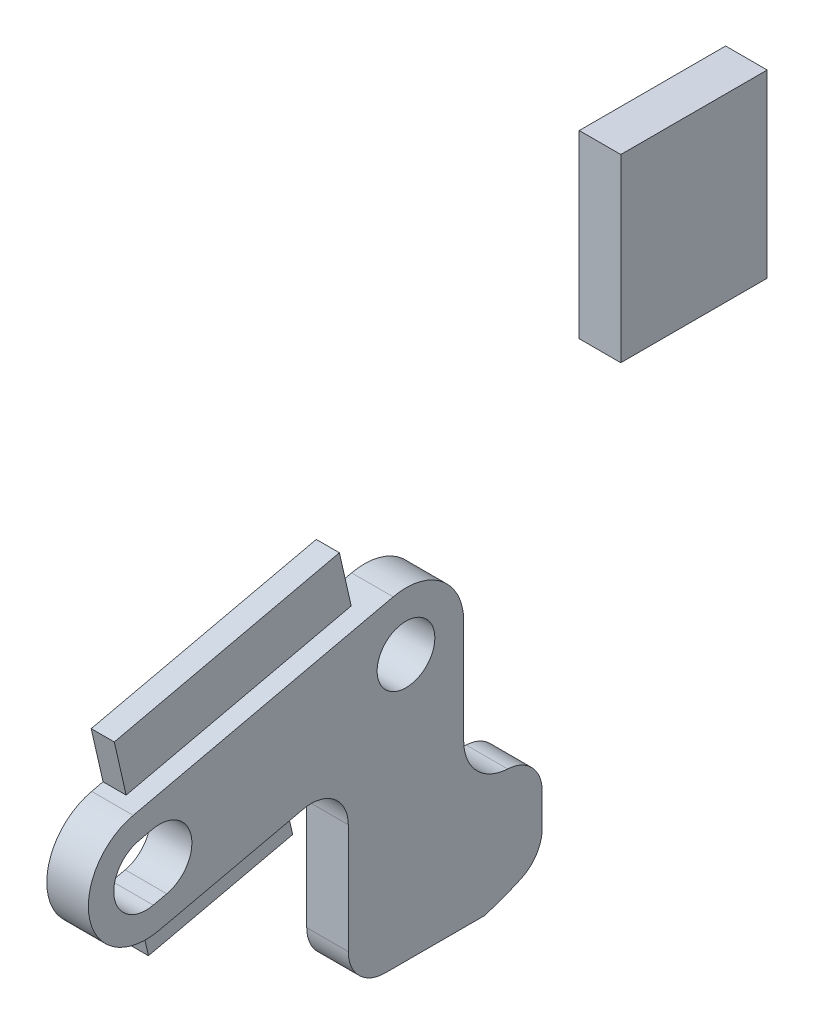
ISO-10303-21;
HEADER;
FILE_DESCRIPTION(('STEP AP214'),'2;1');
FILE_NAME('part.step','',(''),(''),'','','');
FILE_SCHEMA(('AUTOMOTIVE_DESIGN { 1 0 10303 214 1 1 1 1 }'));
ENDSEC;
DATA;
#1=APPLICATION_CONTEXT('core data for automotive mechanical design processes');
#2=APPLICATION_PROTOCOL_DEFINITION('international standard','automotive_design',2000,#1);
#3=PRODUCT_CONTEXT('',#1,'mechanical');
#4=PRODUCT('Part','Part','',(#3));
#5=PRODUCT_RELATED_PRODUCT_CATEGORY('part','',(#4));
#6=PRODUCT_DEFINITION_FORMATION('','',#4);
#7=PRODUCT_DEFINITION_CONTEXT('part definition',#1,'design');
#8=PRODUCT_DEFINITION('design','',#6,#7);
#9=PRODUCT_DEFINITION_SHAPE('','',#8);
#10=(LENGTH_UNIT() NAMED_UNIT(*) SI_UNIT(.MILLI.,.METRE.));
#11=(NAMED_UNIT(*) PLANE_ANGLE_UNIT() SI_UNIT($,.RADIAN.));
#12=(NAMED_UNIT(*) SI_UNIT($,.STERADIAN.) SOLID_ANGLE_UNIT());
#13=UNCERTAINTY_MEASURE_WITH_UNIT(LENGTH_MEASURE(1.E-05),#10,'distance_accuracy_value','');
#14=(GEOMETRIC_REPRESENTATION_CONTEXT(3) GLOBAL_UNCERTAINTY_ASSIGNED_CONTEXT((#13)) GLOBAL_UNIT_ASSIGNED_CONTEXT((#10,
#11,#12)) REPRESENTATION_CONTEXT('',''));
#15=CARTESIAN_POINT('',(0.,0.,0.));
#16=DIRECTION('',(0.,0.,1.));
#17=DIRECTION('',(1.,0.,0.));
#18=AXIS2_PLACEMENT_3D('',#15,#16,#17);
#19=CARTESIAN_POINT('',(-12.7783936670699,45.2138103486577,-7.49877949980136));
#20=DIRECTION('',(0.,0.,1.));
#21=DIRECTION('',(1.,0.,0.));
#22=AXIS2_PLACEMENT_3D('',#19,#20,#21);
#23=PLANE('',#22);
#24=DIRECTION('',(0.,1.,0.));
#25=VECTOR('',#24,1.);
#26=CARTESIAN_POINT('',(0.,45.2138103486577,-7.49877949980136));
#27=LINE('',#26,#25);
#28=CARTESIAN_POINT('',(0.,35.2927508898382,-7.49877949980136));
#29=VERTEX_POINT('',#28);
#30=CARTESIAN_POINT('',(0.,45.2138103486577,-7.49877949980136));
#31=VERTEX_POINT('',#30);
#32=EDGE_CURVE('E61',#29,#31,#27,.T.);
#33=ORIENTED_EDGE('',*,*,#32,.F.);
#34=DIRECTION('',(1.,0.,0.));
#35=VECTOR('',#34,1.);
#36=CARTESIAN_POINT('',(-12.7783936670699,35.2927508898382,-7.49877949980136));
#37=LINE('',#36,#35);
#38=CARTESIAN_POINT('',(2.286,35.2927508898382,-7.49877949980136));
#39=VERTEX_POINT('',#38);
#40=EDGE_CURVE('E89',#29,#39,#37,.T.);
#41=ORIENTED_EDGE('',*,*,#40,.T.);
#42=DIRECTION('',(0.,-1.,0.));
#43=VECTOR('',#42,1.);
#44=CARTESIAN_POINT('',(2.286,45.2138103486577,-7.49877949980136));
#45=LINE('',#44,#43);
#46=CARTESIAN_POINT('',(2.286,45.2138103486577,-7.49877949980136));
#47=VERTEX_POINT('',#46);
#48=EDGE_CURVE('E93',#47,#39,#45,.T.);
#49=ORIENTED_EDGE('',*,*,#48,.F.);
#50=DIRECTION('',(1.,0.,0.));
#51=VECTOR('',#50,1.);
#52=CARTESIAN_POINT('',(-12.7783936670699,45.2138103486577,-7.49877949980136));
#53=LINE('',#52,#51);
#54=EDGE_CURVE('E116',#31,#47,#53,.T.);
#55=ORIENTED_EDGE('',*,*,#54,.F.);
#56=EDGE_LOOP('',(#33,#41,#49,#55));
#57=FACE_BOUND('',#56,.T.);
#58=ADVANCED_FACE('F53',(#57),#23,.T.);
#59=CARTESIAN_POINT('',(-12.7783936670699,45.2138103486577,-7.49877949980136));
#60=DIRECTION('',(0.,1.,0.));
#61=DIRECTION('',(0.,0.,1.));
#62=AXIS2_PLACEMENT_3D('',#59,#60,#61);
#63=PLANE('',#62);
#64=DIRECTION('',(0.,0.,-1.));
#65=VECTOR('',#64,1.);
#66=CARTESIAN_POINT('',(0.,45.2138103486577,-7.49877949980136));
#67=LINE('',#66,#65);
#68=CARTESIAN_POINT('',(0.,45.2138103486577,-15.5523454134313));
#69=VERTEX_POINT('',#68);
#70=EDGE_CURVE('E67',#31,#69,#67,.T.);
#71=ORIENTED_EDGE('',*,*,#70,.F.);
#72=ORIENTED_EDGE('',*,*,#54,.T.);
#73=DIRECTION('',(0.,0.,1.));
#74=VECTOR('',#73,1.);
#75=CARTESIAN_POINT('',(2.286,45.2138103486577,-7.49877949980136));
#76=LINE('',#75,#74);
#77=CARTESIAN_POINT('',(2.286,45.2138103486577,-15.5523454134313));
#78=VERTEX_POINT('',#77);
#79=EDGE_CURVE('E98',#78,#47,#76,.T.);
#80=ORIENTED_EDGE('',*,*,#79,.F.);
#81=DIRECTION('',(1.,0.,0.));
#82=VECTOR('',#81,1.);
#83=CARTESIAN_POINT('',(-12.7783936670699,45.2138103486577,-15.5523454134313));
#84=LINE('',#83,#82);
#85=EDGE_CURVE('E119',#69,#78,#84,.T.);
#86=ORIENTED_EDGE('',*,*,#85,.F.);
#87=EDGE_LOOP('',(#71,#72,#80,#86));
#88=FACE_BOUND('',#87,.T.);
#89=ADVANCED_FACE('F125',(#88),#63,.T.);
#90=CARTESIAN_POINT('',(-12.7783936670699,45.2138103486577,-15.5523454134313));
#91=DIRECTION('',(0.,0.,-1.));
#92=DIRECTION('',(-1.,0.,0.));
#93=AXIS2_PLACEMENT_3D('',#90,#91,#92);
#94=PLANE('',#93);
#95=DIRECTION('',(0.,-1.,0.));
#96=VECTOR('',#95,1.);
#97=CARTESIAN_POINT('',(0.,45.2138103486577,-15.5523454134313));
#98=LINE('',#97,#96);
#99=CARTESIAN_POINT('',(0.,35.2927508898382,-15.5523454134313));
#100=VERTEX_POINT('',#99);
#101=EDGE_CURVE('E118',#69,#100,#98,.T.);
#102=ORIENTED_EDGE('',*,*,#101,.F.);
#103=ORIENTED_EDGE('',*,*,#85,.T.);
#104=DIRECTION('',(0.,1.,0.));
#105=VECTOR('',#104,1.);
#106=CARTESIAN_POINT('',(2.286,45.2138103486577,-15.5523454134313));
#107=LINE('',#106,#105);
#108=CARTESIAN_POINT('',(2.286,35.2927508898382,-15.5523454134313));
#109=VERTEX_POINT('',#108);
#110=EDGE_CURVE('E106',#109,#78,#107,.T.);
#111=ORIENTED_EDGE('',*,*,#110,.F.);
#112=DIRECTION('',(1.,0.,0.));
#113=VECTOR('',#112,1.);
#114=CARTESIAN_POINT('',(-12.7783936670699,35.2927508898382,-15.5523454134313));
#115=LINE('',#114,#113);
#116=EDGE_CURVE('E97',#100,#109,#115,.T.);
#117=ORIENTED_EDGE('',*,*,#116,.F.);
#118=EDGE_LOOP('',(#102,#103,#111,#117));
#119=FACE_BOUND('',#118,.T.);
#120=ADVANCED_FACE('F123',(#119),#94,.T.);
#121=CARTESIAN_POINT('',(-12.7783936670699,35.2927508898382,-7.49877949980136));
#122=DIRECTION('',(0.,-1.,0.));
#123=DIRECTION('',(0.,0.,-1.));
#124=AXIS2_PLACEMENT_3D('',#121,#122,#123);
#125=PLANE('',#124);
#126=DIRECTION('',(0.,0.,1.));
#127=VECTOR('',#126,1.);
#128=CARTESIAN_POINT('',(0.,35.2927508898382,-7.49877949980136));
#129=LINE('',#128,#127);
#130=EDGE_CURVE('E12',#100,#29,#129,.T.);
#131=ORIENTED_EDGE('',*,*,#130,.F.);
#132=ORIENTED_EDGE('',*,*,#116,.T.);
#133=DIRECTION('',(0.,0.,-1.));
#134=VECTOR('',#133,1.);
#135=CARTESIAN_POINT('',(2.286,35.2927508898382,-7.49877949980136));
#136=LINE('',#135,#134);
#137=EDGE_CURVE('E100',#39,#109,#136,.T.);
#138=ORIENTED_EDGE('',*,*,#137,.F.);
#139=ORIENTED_EDGE('',*,*,#40,.F.);
#140=EDGE_LOOP('',(#131,#132,#138,#139));
#141=FACE_BOUND('',#140,.T.);
#142=ADVANCED_FACE('F101',(#141),#125,.T.);
#143=CARTESIAN_POINT('',(2.286,0.,0.));
#144=DIRECTION('',(1.,0.,0.));
#145=DIRECTION('',(0.,0.,-1.));
#146=AXIS2_PLACEMENT_3D('',#143,#144,#145);
#147=PLANE('',#146);
#148=ORIENTED_EDGE('',*,*,#48,.T.);
#149=ORIENTED_EDGE('',*,*,#137,.T.);
#150=ORIENTED_EDGE('',*,*,#110,.T.);
#151=ORIENTED_EDGE('',*,*,#79,.T.);
#152=EDGE_LOOP('',(#148,#149,#150,#151));
#153=FACE_BOUND('',#152,.T.);
#154=ADVANCED_FACE('F108',(#153),#147,.T.);
#155=CARTESIAN_POINT('',(0.,24.0453194559547,18.6173248138089));
#156=DIRECTION('',(1.,0.,0.));
#157=DIRECTION('',(0.,0.,-1.));
#158=AXIS2_PLACEMENT_3D('',#155,#156,#157);
#159=PLANE('',#158);
#160=ORIENTED_EDGE('',*,*,#32,.T.);
#161=ORIENTED_EDGE('',*,*,#70,.T.);
#162=ORIENTED_EDGE('',*,*,#101,.T.);
#163=ORIENTED_EDGE('',*,*,#130,.T.);
#164=EDGE_LOOP('',(#160,#161,#162,#163));
#165=FACE_BOUND('',#164,.T.);
#166=ADVANCED_FACE('F127',(#165),#159,.F.);
#167=CLOSED_SHELL('',(#58,#89,#120,#142,#154,#166));
#168=MANIFOLD_SOLID_BREP('B2',#167);
#169=CARTESIAN_POINT('',(2.286,23.3247743636414,7.493));
#170=DIRECTION('',(0.,0.974987740626705,0.222258645788262));
#171=DIRECTION('',(0.,-0.222258645788262,0.974987740626705));
#172=AXIS2_PLACEMENT_3D('',#169,#170,#171);
#173=PLANE('',#172);
#174=DIRECTION('',(0.,0.222258645788262,-0.974987740626705));
#175=VECTOR('',#174,1.);
#176=CARTESIAN_POINT('',(1.27,22.7586050453254,9.97662956824175));
#177=LINE('',#176,#175);
#178=CARTESIAN_POINT('',(1.27,20.9497333794648,17.9116536134312));
#179=VERTEX_POINT('',#178);
#180=CARTESIAN_POINT('',(1.27,22.7586050453254,9.97662956824175));
#181=VERTEX_POINT('',#180);
#182=EDGE_CURVE('E357',#179,#181,#177,.T.);
#183=ORIENTED_EDGE('',*,*,#182,.T.);
#184=DIRECTION('',(-1.,0.,0.));
#185=VECTOR('',#184,1.);
#186=CARTESIAN_POINT('',(2.286,22.7586050453254,9.97662956824175));
#187=LINE('',#186,#185);
#188=CARTESIAN_POINT('',(2.286,22.7586050453254,9.97662956824175));
#189=VERTEX_POINT('',#188);
#190=EDGE_CURVE('E572',#181,#189,#187,.F.);
#191=ORIENTED_EDGE('',*,*,#190,.T.);
#192=DIRECTION('',(0.,0.222258645788262,-0.974987740626706));
#193=VECTOR('',#192,1.);
#194=CARTESIAN_POINT('',(2.286,23.3247743636414,7.493));
#195=LINE('',#194,#193);
#196=CARTESIAN_POINT('',(2.286,20.9497333794648,17.9116536134312));
#197=VERTEX_POINT('',#196);
#198=EDGE_CURVE('E517',#197,#189,#195,.T.);
#199=ORIENTED_EDGE('',*,*,#198,.F.);
#200=DIRECTION('',(-1.,0.,0.));
#201=VECTOR('',#200,1.);
#202=CARTESIAN_POINT('',(2.286,20.9497333794648,17.9116536134312));
#203=LINE('',#202,#201);
#204=EDGE_CURVE('E506',#197,#179,#203,.T.);
#205=ORIENTED_EDGE('',*,*,#204,.T.);
#206=EDGE_LOOP('',(#183,#191,#199,#205));
#207=FACE_BOUND('',#206,.T.);
#208=ADVANCED_FACE('F178',(#207),#173,.F.);
#209=CARTESIAN_POINT('',(2.286,24.0453194559547,18.6173248138089));
#210=DIRECTION('',(1.,0.,0.));
#211=DIRECTION('',(0.,0.,-1.));
#212=AXIS2_PLACEMENT_3D('',#209,#210,#211);
#213=PLANE('',#212);
#214=DIRECTION('',(0.,1.,0.));
#215=VECTOR('',#214,1.);
#216=CARTESIAN_POINT('',(2.286,15.875,-3.175));
#217=LINE('',#216,#215);
#218=CARTESIAN_POINT('',(2.286,15.2692893877702,-3.175));
#219=VERTEX_POINT('',#218);
#220=CARTESIAN_POINT('',(2.286,17.0554310017379,-3.175));
#221=VERTEX_POINT('',#220);
#222=EDGE_CURVE('E550',#219,#221,#217,.T.);
#223=ORIENTED_EDGE('',*,*,#222,.T.);
#224=CARTESIAN_POINT('',(2.286,17.0554310017379,-1.175));
#225=DIRECTION('',(1.,0.,0.));
#226=DIRECTION('',(0.,0.,-1.));
#227=AXIS2_PLACEMENT_3D('',#224,#225,#226);
#228=CIRCLE('',#227,2.);
#229=CARTESIAN_POINT('',(2.286,19.0530384899591,-1.27279735682819));
#230=VERTEX_POINT('',#229);
#231=EDGE_CURVE('E51',#221,#230,#228,.T.);
#232=ORIENTED_EDGE('',*,*,#231,.T.);
#233=CARTESIAN_POINT('',(2.286,21.59,-1.397));
#234=DIRECTION('',(1.,0.,0.));
#235=DIRECTION('',(0.,0.,-1.));
#236=AXIS2_PLACEMENT_3D('',#233,#234,#235);
#237=CIRCLE('',#236,2.54);
#238=CARTESIAN_POINT('',(2.286,21.59,1.143));
#239=VERTEX_POINT('',#238);
#240=EDGE_CURVE('E581',#230,#239,#237,.F.);
#241=ORIENTED_EDGE('',*,*,#240,.T.);
#242=DIRECTION('',(0.,1.,0.));
#243=VECTOR('',#242,1.);
#244=CARTESIAN_POINT('',(2.286,27.305,1.143));
#245=LINE('',#244,#243);
#246=CARTESIAN_POINT('',(2.286,27.305,1.143));
#247=VERTEX_POINT('',#246);
#248=EDGE_CURVE('E552',#239,#247,#245,.T.);
#249=ORIENTED_EDGE('',*,*,#248,.T.);
#250=CARTESIAN_POINT('',(2.286,27.305,4.318));
#251=DIRECTION('',(1.,0.,0.));
#252=DIRECTION('',(0.,0.,-1.));
#253=AXIS2_PLACEMENT_3D('',#250,#251,#252);
#254=CIRCLE('',#253,3.175);
#255=CARTESIAN_POINT('',(2.286,30.4005860764898,5.0236712003777));
#256=VERTEX_POINT('',#255);
#257=EDGE_CURVE('E446',#247,#256,#254,.T.);
#258=ORIENTED_EDGE('',*,*,#257,.T.);
#259=DIRECTION('',(0.,-0.222258645788251,0.974987740626708));
#260=VECTOR('',#259,1.);
#261=CARTESIAN_POINT('',(2.286,27.1409055324445,19.3229960141867));
#262=LINE('',#261,#260);
#263=CARTESIAN_POINT('',(2.286,27.1409055324445,19.3229960141867));
#264=VERTEX_POINT('',#263);
#265=EDGE_CURVE('E440',#256,#264,#262,.T.);
#266=ORIENTED_EDGE('',*,*,#265,.T.);
#267=CARTESIAN_POINT('',(2.286,24.0453194559547,18.6173248138089));
#268=DIRECTION('',(1.,0.,0.));
#269=DIRECTION('',(0.,0.,-1.));
#270=AXIS2_PLACEMENT_3D('',#267,#268,#269);
#271=CIRCLE('',#270,3.17500000000008);
#272=EDGE_CURVE('E514',#264,#197,#271,.T.);
#273=ORIENTED_EDGE('',*,*,#272,.T.);
#274=ORIENTED_EDGE('',*,*,#198,.T.);
#275=CARTESIAN_POINT('',(2.286,20.777429956372,9.525));
#276=DIRECTION('',(1.,0.,0.));
#277=DIRECTION('',(0.,0.,-1.));
#278=AXIS2_PLACEMENT_3D('',#275,#276,#277);
#279=CIRCLE('',#278,2.032);
#280=CARTESIAN_POINT('',(2.286,20.777429956372,7.493));
#281=VERTEX_POINT('',#280);
#282=EDGE_CURVE('E576',#189,#281,#279,.F.);
#283=ORIENTED_EDGE('',*,*,#282,.T.);
#284=DIRECTION('',(0.,-1.,0.));
#285=VECTOR('',#284,1.);
#286=CARTESIAN_POINT('',(2.286,12.7,7.493));
#287=LINE('',#286,#285);
#288=CARTESIAN_POINT('',(2.286,14.732,7.493));
#289=VERTEX_POINT('',#288);
#290=EDGE_CURVE('E544',#281,#289,#287,.T.);
#291=ORIENTED_EDGE('',*,*,#290,.T.);
#292=CARTESIAN_POINT('',(2.286,14.732,5.461));
#293=DIRECTION('',(1.,0.,0.));
#294=DIRECTION('',(0.,0.,-1.));
#295=AXIS2_PLACEMENT_3D('',#292,#293,#294);
#296=CIRCLE('',#295,2.032);
#297=CARTESIAN_POINT('',(2.286,12.7,5.461));
#298=VERTEX_POINT('',#297);
#299=EDGE_CURVE('E570',#289,#298,#296,.T.);
#300=ORIENTED_EDGE('',*,*,#299,.T.);
#301=DIRECTION('',(0.,0.,-1.));
#302=VECTOR('',#301,1.);
#303=CARTESIAN_POINT('',(2.286,12.7,-3.175));
#304=LINE('',#303,#302);
#305=CARTESIAN_POINT('',(2.286,12.7,0.));
#306=VERTEX_POINT('',#305);
#307=EDGE_CURVE('E547',#298,#306,#304,.T.);
#308=ORIENTED_EDGE('',*,*,#307,.T.);
#309=CARTESIAN_POINT('',(2.286,27.305,4.318));
#310=DIRECTION('',(-1.,0.,0.));
#311=DIRECTION('',(0.,0.,-1.));
#312=AXIS2_PLACEMENT_3D('',#309,#310,#311);
#313=CIRCLE('',#312,15.229942514665);
#314=CARTESIAN_POINT('',(2.286,13.4498240954776,-2.00538909563079));
#315=VERTEX_POINT('',#314);
#316=EDGE_CURVE('E407',#315,#306,#313,.T.);
#317=ORIENTED_EDGE('',*,*,#316,.F.);
#318=CARTESIAN_POINT('',(2.286,15.2692893877702,-1.175));
#319=DIRECTION('',(1.,0.,0.));
#320=DIRECTION('',(0.,0.,-1.));
#321=AXIS2_PLACEMENT_3D('',#318,#319,#320);
#322=CIRCLE('',#321,2.);
#323=EDGE_CURVE('E586',#315,#219,#322,.T.);
#324=ORIENTED_EDGE('',*,*,#323,.T.);
#325=EDGE_LOOP('',(#223,#232,#241,#249,#258,#266,#273,#274,#283,#291,#300,#308,#317,#324));
#326=FACE_BOUND('',#325,.T.);
#327=CARTESIAN_POINT('',(2.286,27.305,4.318));
#328=DIRECTION('',(1.,0.,0.));
#329=DIRECTION('',(0.,0.,-1.));
#330=AXIS2_PLACEMENT_3D('',#327,#328,#329);
#331=CIRCLE('',#330,1.5875);
#332=CARTESIAN_POINT('',(2.286,27.305,2.7305));
#333=VERTEX_POINT('',#332);
#334=EDGE_CURVE('E528',#333,#333,#331,.T.);
#335=ORIENTED_EDGE('',*,*,#334,.F.);
#336=EDGE_LOOP('',(#335));
#337=FACE_BOUND('',#336,.T.);
#338=DIRECTION('',(0.,0.222258645788256,-0.974987740626707));
#339=VECTOR('',#338,1.);
#340=CARTESIAN_POINT('',(2.286,22.3117912531204,18.2221489415974));
#341=LINE('',#340,#339);
#342=CARTESIAN_POINT('',(2.286,22.3117912531204,18.2221489415974));
#343=VERTEX_POINT('',#342);
#344=CARTESIAN_POINT('',(2.286,22.481152341211,17.4792082832399));
#345=VERTEX_POINT('',#344);
#346=EDGE_CURVE('E425',#343,#345,#341,.T.);
#347=ORIENTED_EDGE('',*,*,#346,.F.);
#348=CARTESIAN_POINT('',(2.286,24.0453194559547,18.6173248138089));
#349=DIRECTION('',(1.,0.,0.));
#350=DIRECTION('',(0.,0.,-1.));
#351=AXIS2_PLACEMENT_3D('',#348,#349,#350);
#352=CIRCLE('',#351,1.778);
#353=CARTESIAN_POINT('',(2.286,25.778847658789,19.0125006860205));
#354=VERTEX_POINT('',#353);
#355=EDGE_CURVE('E421',#354,#343,#352,.T.);
#356=ORIENTED_EDGE('',*,*,#355,.F.);
#357=DIRECTION('',(0.,-0.222258645788258,0.974987740626706));
#358=VECTOR('',#357,1.);
#359=CARTESIAN_POINT('',(2.286,25.778847658789,19.0125006860205));
#360=LINE('',#359,#358);
#361=CARTESIAN_POINT('',(2.286,25.9482087468796,18.2695600276629));
#362=VERTEX_POINT('',#361);
#363=EDGE_CURVE('E913',#362,#354,#360,.T.);
#364=ORIENTED_EDGE('',*,*,#363,.F.);
#365=CARTESIAN_POINT('',(2.286,24.2146805440453,17.8743841554514));
#366=DIRECTION('',(1.,0.,0.));
#367=DIRECTION('',(0.,0.,-1.));
#368=AXIS2_PLACEMENT_3D('',#365,#366,#367);
#369=CIRCLE('',#368,1.77800000000001);
#370=EDGE_CURVE('E928',#345,#362,#369,.T.);
#371=ORIENTED_EDGE('',*,*,#370,.F.);
#372=EDGE_LOOP('',(#347,#356,#364,#371));
#373=FACE_BOUND('',#372,.T.);
#374=ADVANCED_FACE('F554',(#326,#337,#373),#213,.T.);
#375=CARTESIAN_POINT('',(0.,24.0453194559547,18.6173248138089));
#376=DIRECTION('',(1.,0.,0.));
#377=DIRECTION('',(0.,0.,-1.));
#378=AXIS2_PLACEMENT_3D('',#375,#376,#377);
#379=PLANE('',#378);
#380=CARTESIAN_POINT('',(0.,27.305,4.318));
#381=DIRECTION('',(1.,0.,0.));
#382=DIRECTION('',(0.,0.,-1.));
#383=AXIS2_PLACEMENT_3D('',#380,#381,#382);
#384=CIRCLE('',#383,1.5875);
#385=CARTESIAN_POINT('',(0.,27.305,2.7305));
#386=VERTEX_POINT('',#385);
#387=EDGE_CURVE('E532',#386,#386,#384,.T.);
#388=ORIENTED_EDGE('',*,*,#387,.T.);
#389=EDGE_LOOP('',(#388));
#390=FACE_BOUND('',#389,.T.);
#391=CARTESIAN_POINT('',(0.,21.59,-1.397));
#392=DIRECTION('',(1.,0.,0.));
#393=DIRECTION('',(0.,0.,-1.));
#394=AXIS2_PLACEMENT_3D('',#391,#392,#393);
#395=CIRCLE('',#394,2.54);
#396=CARTESIAN_POINT('',(0.,21.59,1.143));
#397=VERTEX_POINT('',#396);
#398=CARTESIAN_POINT('',(0.,19.0530384899591,-1.27279735682819));
#399=VERTEX_POINT('',#398);
#400=EDGE_CURVE('E579',#397,#399,#395,.T.);
#401=ORIENTED_EDGE('',*,*,#400,.T.);
#402=CARTESIAN_POINT('',(0.,17.0554310017379,-1.175));
#403=DIRECTION('',(1.,0.,0.));
#404=DIRECTION('',(0.,0.,-1.));
#405=AXIS2_PLACEMENT_3D('',#402,#403,#404);
#406=CIRCLE('',#405,2.);
#407=CARTESIAN_POINT('',(0.,17.0554310017379,-3.175));
#408=VERTEX_POINT('',#407);
#409=EDGE_CURVE('E595',#399,#408,#406,.F.);
#410=ORIENTED_EDGE('',*,*,#409,.T.);
#411=DIRECTION('',(0.,1.,0.));
#412=VECTOR('',#411,1.);
#413=CARTESIAN_POINT('',(0.,19.05,-3.175));
#414=LINE('',#413,#412);
#415=CARTESIAN_POINT('',(0.,15.2692893877702,-3.175));
#416=VERTEX_POINT('',#415);
#417=EDGE_CURVE('E478',#416,#408,#414,.T.);
#418=ORIENTED_EDGE('',*,*,#417,.F.);
#419=CARTESIAN_POINT('',(0.,15.2692893877702,-1.175));
#420=DIRECTION('',(1.,0.,0.));
#421=DIRECTION('',(0.,0.,-1.));
#422=AXIS2_PLACEMENT_3D('',#419,#420,#421);
#423=CIRCLE('',#422,2.);
#424=CARTESIAN_POINT('',(0.,13.4498240954776,-2.00538909563079));
#425=VERTEX_POINT('',#424);
#426=EDGE_CURVE('E590',#416,#425,#423,.F.);
#427=ORIENTED_EDGE('',*,*,#426,.T.);
#428=CARTESIAN_POINT('',(0.,27.305,4.318));
#429=DIRECTION('',(-1.,0.,0.));
#430=DIRECTION('',(0.,0.,-1.));
#431=AXIS2_PLACEMENT_3D('',#428,#429,#430);
#432=CIRCLE('',#431,15.229942514665);
#433=CARTESIAN_POINT('',(0.,12.7,0.));
#434=VERTEX_POINT('',#433);
#435=EDGE_CURVE('E414',#425,#434,#432,.T.);
#436=ORIENTED_EDGE('',*,*,#435,.T.);
#437=DIRECTION('',(0.,0.,-1.));
#438=VECTOR('',#437,1.);
#439=CARTESIAN_POINT('',(0.,12.7,-3.175));
#440=LINE('',#439,#438);
#441=CARTESIAN_POINT('',(0.,12.7,5.461));
#442=VERTEX_POINT('',#441);
#443=EDGE_CURVE('E474',#442,#434,#440,.T.);
#444=ORIENTED_EDGE('',*,*,#443,.F.);
#445=CARTESIAN_POINT('',(0.,14.732,5.461));
#446=DIRECTION('',(1.,0.,0.));
#447=DIRECTION('',(0.,0.,-1.));
#448=AXIS2_PLACEMENT_3D('',#445,#446,#447);
#449=CIRCLE('',#448,2.032);
#450=CARTESIAN_POINT('',(0.,14.732,7.493));
#451=VERTEX_POINT('',#450);
#452=EDGE_CURVE('E562',#442,#451,#449,.F.);
#453=ORIENTED_EDGE('',*,*,#452,.T.);
#454=DIRECTION('',(0.,-1.,0.));
#455=VECTOR('',#454,1.);
#456=CARTESIAN_POINT('',(0.,12.7,7.493));
#457=LINE('',#456,#455);
#458=CARTESIAN_POINT('',(0.,20.777429956372,7.493));
#459=VERTEX_POINT('',#458);
#460=EDGE_CURVE('E479',#459,#451,#457,.T.);
#461=ORIENTED_EDGE('',*,*,#460,.F.);
#462=CARTESIAN_POINT('',(0.,20.777429956372,9.525));
#463=DIRECTION('',(1.,0.,0.));
#464=DIRECTION('',(0.,0.,-1.));
#465=AXIS2_PLACEMENT_3D('',#462,#463,#464);
#466=CIRCLE('',#465,2.032);
#467=CARTESIAN_POINT('',(0.,22.7586050453254,9.97662956824175));
#468=VERTEX_POINT('',#467);
#469=EDGE_CURVE('E574',#459,#468,#466,.T.);
#470=ORIENTED_EDGE('',*,*,#469,.T.);
#471=DIRECTION('',(0.,-0.974987740626705,-0.222258645788263));
#472=VECTOR('',#471,1.);
#473=CARTESIAN_POINT('',(0.,22.7586050453254,9.97662956824175));
#474=LINE('',#473,#472);
#475=CARTESIAN_POINT('',(0.,20.825502156244,9.53595856039866));
#476=VERTEX_POINT('',#475);
#477=EDGE_CURVE('E380',#468,#476,#474,.T.);
#478=ORIENTED_EDGE('',*,*,#477,.T.);
#479=DIRECTION('',(0.,-0.222258645788262,0.974987740626705));
#480=VECTOR('',#479,1.);
#481=CARTESIAN_POINT('',(0.,20.825502156244,9.53595856039866));
#482=LINE('',#481,#480);
#483=CARTESIAN_POINT('',(0.,19.0166304903833,17.4709826055881));
#484=VERTEX_POINT('',#483);
#485=EDGE_CURVE('E351',#476,#484,#482,.T.);
#486=ORIENTED_EDGE('',*,*,#485,.T.);
#487=DIRECTION('',(0.,0.974987740626705,0.222258645788262));
#488=VECTOR('',#487,1.);
#489=CARTESIAN_POINT('',(0.,20.9497333794648,17.9116536134312));
#490=LINE('',#489,#488);
#491=CARTESIAN_POINT('',(0.,20.9497333794648,17.9116536134312));
#492=VERTEX_POINT('',#491);
#493=EDGE_CURVE('E372',#484,#492,#490,.T.);
#494=ORIENTED_EDGE('',*,*,#493,.T.);
#495=CARTESIAN_POINT('',(0.,24.0453194559547,18.6173248138089));
#496=DIRECTION('',(1.,0.,0.));
#497=DIRECTION('',(0.,0.,-1.));
#498=AXIS2_PLACEMENT_3D('',#495,#496,#497);
#499=CIRCLE('',#498,3.17500000000008);
#500=CARTESIAN_POINT('',(0.,27.1409055324445,19.3229960141867));
#501=VERTEX_POINT('',#500);
#502=EDGE_CURVE('E448',#501,#492,#499,.T.);
#503=ORIENTED_EDGE('',*,*,#502,.F.);
#504=DIRECTION('',(0.,-0.222258645788251,0.974987740626708));
#505=VECTOR('',#504,1.);
#506=CARTESIAN_POINT('',(0.,27.1409055324445,19.3229960141867));
#507=LINE('',#506,#505);
#508=CARTESIAN_POINT('',(0.,27.2834547165691,18.6976718272925));
#509=VERTEX_POINT('',#508);
#510=EDGE_CURVE('E463',#509,#501,#507,.T.);
#511=ORIENTED_EDGE('',*,*,#510,.F.);
#512=DIRECTION('',(0.,0.974987740626708,0.222258645788251));
#513=VECTOR('',#512,1.);
#514=CARTESIAN_POINT('',(0.,27.2834547165691,18.6976718272925));
#515=LINE('',#514,#513);
#516=CARTESIAN_POINT('',(0.,30.1434499845427,19.3496376405366));
#517=VERTEX_POINT('',#516);
#518=EDGE_CURVE('E400',#509,#517,#515,.T.);
#519=ORIENTED_EDGE('',*,*,#518,.T.);
#520=DIRECTION('',(0.,0.222258645788251,-0.974987740626708));
#521=VECTOR('',#520,1.);
#522=CARTESIAN_POINT('',(0.,32.9661347860535,6.96729333457737));
#523=LINE('',#522,#521);
#524=CARTESIAN_POINT('',(0.,32.9661347860535,6.96729333457737));
#525=VERTEX_POINT('',#524);
#526=EDGE_CURVE('E389',#517,#525,#523,.T.);
#527=ORIENTED_EDGE('',*,*,#526,.T.);
#528=DIRECTION('',(0.,-0.974987740626708,-0.222258645788251));
#529=VECTOR('',#528,1.);
#530=CARTESIAN_POINT('',(0.,30.1061395180798,6.31532752133336));
#531=LINE('',#530,#529);
#532=CARTESIAN_POINT('',(0.,30.1061395180798,6.31532752133336));
#533=VERTEX_POINT('',#532);
#534=EDGE_CURVE('E384',#525,#533,#531,.T.);
#535=ORIENTED_EDGE('',*,*,#534,.T.);
#536=CARTESIAN_POINT('',(0.,30.4005860764898,5.0236712003777));
#537=VERTEX_POINT('',#536);
#538=EDGE_CURVE('E466',#537,#533,#507,.T.);
#539=ORIENTED_EDGE('',*,*,#538,.F.);
#540=CARTESIAN_POINT('',(0.,27.305,4.318));
#541=DIRECTION('',(1.,0.,0.));
#542=DIRECTION('',(0.,0.,-1.));
#543=AXIS2_PLACEMENT_3D('',#540,#541,#542);
#544=CIRCLE('',#543,3.175);
#545=CARTESIAN_POINT('',(0.,27.305,1.143));
#546=VERTEX_POINT('',#545);
#547=EDGE_CURVE('E459',#546,#537,#544,.T.);
#548=ORIENTED_EDGE('',*,*,#547,.F.);
#549=DIRECTION('',(0.,1.,0.));
#550=VECTOR('',#549,1.);
#551=CARTESIAN_POINT('',(0.,27.305,1.143));
#552=LINE('',#551,#550);
#553=EDGE_CURVE('E464',#397,#546,#552,.T.);
#554=ORIENTED_EDGE('',*,*,#553,.F.);
#555=EDGE_LOOP('',(#401,#410,#418,#427,#436,#444,#453,#461,#470,#478,#486,#494,#503,#511,#519,
#527,#535,#539,#548,#554));
#556=FACE_BOUND('',#555,.T.);
#557=CARTESIAN_POINT('',(0.,24.0453194559547,18.6173248138089));
#558=DIRECTION('',(1.,0.,0.));
#559=DIRECTION('',(0.,0.,-1.));
#560=AXIS2_PLACEMENT_3D('',#557,#558,#559);
#561=CIRCLE('',#560,1.778);
#562=CARTESIAN_POINT('',(0.,25.778847658789,19.0125006860205));
#563=VERTEX_POINT('',#562);
#564=CARTESIAN_POINT('',(0.,22.3117912531204,18.2221489415974));
#565=VERTEX_POINT('',#564);
#566=EDGE_CURVE('E420',#563,#565,#561,.T.);
#567=ORIENTED_EDGE('',*,*,#566,.T.);
#568=DIRECTION('',(0.,0.222258645788256,-0.974987740626707));
#569=VECTOR('',#568,1.);
#570=CARTESIAN_POINT('',(0.,22.3117912531204,18.2221489415974));
#571=LINE('',#570,#569);
#572=CARTESIAN_POINT('',(0.,22.481152341211,17.4792082832399));
#573=VERTEX_POINT('',#572);
#574=EDGE_CURVE('E908',#565,#573,#571,.T.);
#575=ORIENTED_EDGE('',*,*,#574,.T.);
#576=CARTESIAN_POINT('',(0.,24.2146805440453,17.8743841554514));
#577=DIRECTION('',(1.,0.,0.));
#578=DIRECTION('',(0.,0.,-1.));
#579=AXIS2_PLACEMENT_3D('',#576,#577,#578);
#580=CIRCLE('',#579,1.77800000000001);
#581=CARTESIAN_POINT('',(0.,25.9482087468796,18.2695600276629));
#582=VERTEX_POINT('',#581);
#583=EDGE_CURVE('E917',#573,#582,#580,.T.);
#584=ORIENTED_EDGE('',*,*,#583,.T.);
#585=DIRECTION('',(0.,-0.222258645788258,0.974987740626706));
#586=VECTOR('',#585,1.);
#587=CARTESIAN_POINT('',(0.,25.778847658789,19.0125006860205));
#588=LINE('',#587,#586);
#589=EDGE_CURVE('E426',#582,#563,#588,.T.);
#590=ORIENTED_EDGE('',*,*,#589,.T.);
#591=EDGE_LOOP('',(#567,#575,#584,#590));
#592=FACE_BOUND('',#591,.T.);
#593=ADVANCED_FACE('F510',(#390,#556,#592),#379,.F.);
#594=CARTESIAN_POINT('',(2.286,24.0453194559547,18.6173248138089));
#595=DIRECTION('',(-1.,0.,0.));
#596=DIRECTION('',(0.,0.,1.));
#597=AXIS2_PLACEMENT_3D('',#594,#595,#596);
#598=CYLINDRICAL_SURFACE('',#597,3.17500000000008);
#599=ORIENTED_EDGE('',*,*,#502,.T.);
#600=DIRECTION('',(-1.,0.,0.));
#601=VECTOR('',#600,1.);
#602=CARTESIAN_POINT('',(1.27,20.9497333794648,17.9116536134312));
#603=LINE('',#602,#601);
#604=EDGE_CURVE('E193',#179,#492,#603,.T.);
#605=ORIENTED_EDGE('',*,*,#604,.F.);
#606=ORIENTED_EDGE('',*,*,#204,.F.);
#607=ORIENTED_EDGE('',*,*,#272,.F.);
#608=DIRECTION('',(-1.,0.,0.));
#609=VECTOR('',#608,1.);
#610=CARTESIAN_POINT('',(2.286,27.1409055324445,19.3229960141867));
#611=LINE('',#610,#609);
#612=EDGE_CURVE('E445',#264,#501,#611,.T.);
#613=ORIENTED_EDGE('',*,*,#612,.T.);
#614=EDGE_LOOP('',(#599,#605,#606,#607,#613));
#615=FACE_BOUND('',#614,.T.);
#616=ADVANCED_FACE('F526',(#615),#598,.T.);
#617=CARTESIAN_POINT('',(2.286,12.7,7.493));
#618=DIRECTION('',(0.,0.,-1.));
#619=DIRECTION('',(0.,1.,0.));
#620=AXIS2_PLACEMENT_3D('',#617,#618,#619);
#621=PLANE('',#620);
#622=ORIENTED_EDGE('',*,*,#460,.T.);
#623=DIRECTION('',(-1.,0.,0.));
#624=VECTOR('',#623,1.);
#625=CARTESIAN_POINT('',(2.286,14.732,7.493));
#626=LINE('',#625,#624);
#627=EDGE_CURVE('E568',#451,#289,#626,.F.);
#628=ORIENTED_EDGE('',*,*,#627,.T.);
#629=ORIENTED_EDGE('',*,*,#290,.F.);
#630=DIRECTION('',(-1.,0.,0.));
#631=VECTOR('',#630,1.);
#632=CARTESIAN_POINT('',(0.,20.777429956372,7.493));
#633=LINE('',#632,#631);
#634=EDGE_CURVE('E565',#281,#459,#633,.T.);
#635=ORIENTED_EDGE('',*,*,#634,.T.);
#636=EDGE_LOOP('',(#622,#628,#629,#635));
#637=FACE_BOUND('',#636,.T.);
#638=ADVANCED_FACE('F625',(#637),#621,.F.);
#639=CARTESIAN_POINT('',(2.286,12.7,-3.175));
#640=DIRECTION('',(0.,1.,0.));
#641=DIRECTION('',(0.,0.,1.));
#642=AXIS2_PLACEMENT_3D('',#639,#640,#641);
#643=PLANE('',#642);
#644=ORIENTED_EDGE('',*,*,#443,.T.);
#645=DIRECTION('',(1.,0.,0.));
#646=VECTOR('',#645,1.);
#647=CARTESIAN_POINT('',(0.,12.7,0.));
#648=LINE('',#647,#646);
#649=EDGE_CURVE('E416',#434,#306,#648,.T.);
#650=ORIENTED_EDGE('',*,*,#649,.T.);
#651=ORIENTED_EDGE('',*,*,#307,.F.);
#652=DIRECTION('',(-1.,0.,0.));
#653=VECTOR('',#652,1.);
#654=CARTESIAN_POINT('',(2.286,12.7,5.461));
#655=LINE('',#654,#653);
#656=EDGE_CURVE('E559',#298,#442,#655,.T.);
#657=ORIENTED_EDGE('',*,*,#656,.T.);
#658=EDGE_LOOP('',(#644,#650,#651,#657));
#659=FACE_BOUND('',#658,.T.);
#660=ADVANCED_FACE('F618',(#659),#643,.F.);
#661=CARTESIAN_POINT('',(2.286,19.05,-3.175));
#662=DIRECTION('',(0.,0.,1.));
#663=DIRECTION('',(1.,0.,0.));
#664=AXIS2_PLACEMENT_3D('',#661,#662,#663);
#665=PLANE('',#664);
#666=ORIENTED_EDGE('',*,*,#417,.T.);
#667=DIRECTION('',(1.,0.,0.));
#668=VECTOR('',#667,1.);
#669=CARTESIAN_POINT('',(2.286,17.0554310017379,-3.175));
#670=LINE('',#669,#668);
#671=EDGE_CURVE('E186',#408,#221,#670,.T.);
#672=ORIENTED_EDGE('',*,*,#671,.T.);
#673=ORIENTED_EDGE('',*,*,#222,.F.);
#674=DIRECTION('',(1.,0.,0.));
#675=VECTOR('',#674,1.);
#676=CARTESIAN_POINT('',(2.286,15.2692893877702,-3.175));
#677=LINE('',#676,#675);
#678=EDGE_CURVE('E588',#219,#416,#677,.F.);
#679=ORIENTED_EDGE('',*,*,#678,.T.);
#680=EDGE_LOOP('',(#666,#672,#673,#679));
#681=FACE_BOUND('',#680,.T.);
#682=ADVANCED_FACE('F597',(#681),#665,.F.);
#683=CARTESIAN_POINT('',(2.286,27.305,1.143));
#684=DIRECTION('',(0.,0.,1.));
#685=DIRECTION('',(1.,0.,0.));
#686=AXIS2_PLACEMENT_3D('',#683,#684,#685);
#687=PLANE('',#686);
#688=ORIENTED_EDGE('',*,*,#248,.F.);
#689=DIRECTION('',(-1.,0.,0.));
#690=VECTOR('',#689,1.);
#691=CARTESIAN_POINT('',(0.,21.59,1.143));
#692=LINE('',#691,#690);
#693=EDGE_CURVE('E498',#239,#397,#692,.T.);
#694=ORIENTED_EDGE('',*,*,#693,.T.);
#695=ORIENTED_EDGE('',*,*,#553,.T.);
#696=DIRECTION('',(-1.,0.,0.));
#697=VECTOR('',#696,1.);
#698=CARTESIAN_POINT('',(2.286,27.305,1.143));
#699=LINE('',#698,#697);
#700=EDGE_CURVE('E495',#247,#546,#699,.T.);
#701=ORIENTED_EDGE('',*,*,#700,.F.);
#702=EDGE_LOOP('',(#688,#694,#695,#701));
#703=FACE_BOUND('',#702,.T.);
#704=ADVANCED_FACE('F494',(#703),#687,.F.);
#705=CARTESIAN_POINT('',(2.286,27.305,4.318));
#706=DIRECTION('',(-1.,0.,0.));
#707=DIRECTION('',(0.,0.,1.));
#708=AXIS2_PLACEMENT_3D('',#705,#706,#707);
#709=CYLINDRICAL_SURFACE('',#708,3.175);
#710=ORIENTED_EDGE('',*,*,#547,.T.);
#711=DIRECTION('',(-1.,0.,0.));
#712=VECTOR('',#711,1.);
#713=CARTESIAN_POINT('',(2.286,30.4005860764898,5.0236712003777));
#714=LINE('',#713,#712);
#715=EDGE_CURVE('E507',#256,#537,#714,.T.);
#716=ORIENTED_EDGE('',*,*,#715,.F.);
#717=ORIENTED_EDGE('',*,*,#257,.F.);
#718=ORIENTED_EDGE('',*,*,#700,.T.);
#719=EDGE_LOOP('',(#710,#716,#717,#718));
#720=FACE_BOUND('',#719,.T.);
#721=ADVANCED_FACE('F503',(#720),#709,.T.);
#722=CARTESIAN_POINT('',(2.286,27.1409055324445,19.3229960141867));
#723=DIRECTION('',(0.,-0.974987740626708,-0.222258645788251));
#724=DIRECTION('',(0.,0.222258645788251,-0.974987740626708));
#725=AXIS2_PLACEMENT_3D('',#722,#723,#724);
#726=PLANE('',#725);
#727=ORIENTED_EDGE('',*,*,#538,.T.);
#728=DIRECTION('',(-1.,0.,0.));
#729=VECTOR('',#728,1.);
#730=CARTESIAN_POINT('',(1.27,30.1061395180798,6.31532752133336));
#731=LINE('',#730,#729);
#732=CARTESIAN_POINT('',(1.27,30.1061395180798,6.31532752133336));
#733=VERTEX_POINT('',#732);
#734=EDGE_CURVE('E397',#733,#533,#731,.T.);
#735=ORIENTED_EDGE('',*,*,#734,.F.);
#736=DIRECTION('',(0.,-0.222258645788251,0.974987740626708));
#737=VECTOR('',#736,1.);
#738=CARTESIAN_POINT('',(1.27,30.1061395180798,6.31532752133336));
#739=LINE('',#738,#737);
#740=CARTESIAN_POINT('',(1.27,27.2834547165691,18.6976718272925));
#741=VERTEX_POINT('',#740);
#742=EDGE_CURVE('E201',#733,#741,#739,.T.);
#743=ORIENTED_EDGE('',*,*,#742,.T.);
#744=DIRECTION('',(-1.,0.,0.));
#745=VECTOR('',#744,1.);
#746=CARTESIAN_POINT('',(1.27,27.2834547165691,18.6976718272925));
#747=LINE('',#746,#745);
#748=EDGE_CURVE('E410',#741,#509,#747,.T.);
#749=ORIENTED_EDGE('',*,*,#748,.T.);
#750=ORIENTED_EDGE('',*,*,#510,.T.);
#751=ORIENTED_EDGE('',*,*,#612,.F.);
#752=ORIENTED_EDGE('',*,*,#265,.F.);
#753=ORIENTED_EDGE('',*,*,#715,.T.);
#754=EDGE_LOOP('',(#727,#735,#743,#749,#750,#751,#752,#753));
#755=FACE_BOUND('',#754,.T.);
#756=ADVANCED_FACE('F521',(#755),#726,.F.);
#757=CARTESIAN_POINT('',(2.286,27.305,4.318));
#758=DIRECTION('',(-1.,0.,0.));
#759=DIRECTION('',(0.,0.,1.));
#760=AXIS2_PLACEMENT_3D('',#757,#758,#759);
#761=CYLINDRICAL_SURFACE('',#760,1.5875);
#762=ORIENTED_EDGE('',*,*,#334,.T.);
#763=EDGE_LOOP('',(#762));
#764=FACE_BOUND('',#763,.T.);
#765=ORIENTED_EDGE('',*,*,#387,.F.);
#766=EDGE_LOOP('',(#765));
#767=FACE_BOUND('',#766,.T.);
#768=ADVANCED_FACE('F687',(#764,#767),#761,.F.);
#769=CARTESIAN_POINT('',(2.286,24.0453194559547,18.6173248138089));
#770=DIRECTION('',(-1.,0.,0.));
#771=DIRECTION('',(0.,0.,1.));
#772=AXIS2_PLACEMENT_3D('',#769,#770,#771);
#773=CYLINDRICAL_SURFACE('',#772,1.778);
#774=ORIENTED_EDGE('',*,*,#566,.F.);
#775=DIRECTION('',(-1.,0.,0.));
#776=VECTOR('',#775,1.);
#777=CARTESIAN_POINT('',(2.286,25.778847658789,19.0125006860205));
#778=LINE('',#777,#776);
#779=EDGE_CURVE('E903',#354,#563,#778,.T.);
#780=ORIENTED_EDGE('',*,*,#779,.F.);
#781=ORIENTED_EDGE('',*,*,#355,.T.);
#782=DIRECTION('',(-1.,0.,0.));
#783=VECTOR('',#782,1.);
#784=CARTESIAN_POINT('',(2.286,22.3117912531204,18.2221489415974));
#785=LINE('',#784,#783);
#786=EDGE_CURVE('E537',#343,#565,#785,.T.);
#787=ORIENTED_EDGE('',*,*,#786,.T.);
#788=EDGE_LOOP('',(#774,#780,#781,#787));
#789=FACE_BOUND('',#788,.T.);
#790=ADVANCED_FACE('F683',(#789),#773,.F.);
#791=CARTESIAN_POINT('',(2.286,22.3117912531204,18.2221489415974));
#792=DIRECTION('',(0.,0.974987740626707,0.222258645788256));
#793=DIRECTION('',(0.,-0.222258645788256,0.974987740626707));
#794=AXIS2_PLACEMENT_3D('',#791,#792,#793);
#795=PLANE('',#794);
#796=ORIENTED_EDGE('',*,*,#574,.F.);
#797=ORIENTED_EDGE('',*,*,#786,.F.);
#798=ORIENTED_EDGE('',*,*,#346,.T.);
#799=DIRECTION('',(-1.,0.,0.));
#800=VECTOR('',#799,1.);
#801=CARTESIAN_POINT('',(2.286,22.481152341211,17.4792082832399));
#802=LINE('',#801,#800);
#803=EDGE_CURVE('E922',#345,#573,#802,.T.);
#804=ORIENTED_EDGE('',*,*,#803,.T.);
#805=EDGE_LOOP('',(#796,#797,#798,#804));
#806=FACE_BOUND('',#805,.T.);
#807=ADVANCED_FACE('F679',(#806),#795,.T.);
#808=CARTESIAN_POINT('',(2.286,24.2146805440453,17.8743841554514));
#809=DIRECTION('',(-1.,0.,0.));
#810=DIRECTION('',(0.,0.,1.));
#811=AXIS2_PLACEMENT_3D('',#808,#809,#810);
#812=CYLINDRICAL_SURFACE('',#811,1.77800000000001);
#813=ORIENTED_EDGE('',*,*,#583,.F.);
#814=ORIENTED_EDGE('',*,*,#803,.F.);
#815=ORIENTED_EDGE('',*,*,#370,.T.);
#816=DIRECTION('',(-1.,0.,0.));
#817=VECTOR('',#816,1.);
#818=CARTESIAN_POINT('',(2.286,25.9482087468796,18.2695600276629));
#819=LINE('',#818,#817);
#820=EDGE_CURVE('E914',#362,#582,#819,.T.);
#821=ORIENTED_EDGE('',*,*,#820,.T.);
#822=EDGE_LOOP('',(#813,#814,#815,#821));
#823=FACE_BOUND('',#822,.T.);
#824=ADVANCED_FACE('F675',(#823),#812,.F.);
#825=CARTESIAN_POINT('',(2.286,25.778847658789,19.0125006860205));
#826=DIRECTION('',(0.,-0.974987740626706,-0.222258645788258));
#827=DIRECTION('',(0.,0.222258645788258,-0.974987740626706));
#828=AXIS2_PLACEMENT_3D('',#825,#826,#827);
#829=PLANE('',#828);
#830=ORIENTED_EDGE('',*,*,#589,.F.);
#831=ORIENTED_EDGE('',*,*,#820,.F.);
#832=ORIENTED_EDGE('',*,*,#363,.T.);
#833=ORIENTED_EDGE('',*,*,#779,.T.);
#834=EDGE_LOOP('',(#830,#831,#832,#833));
#835=FACE_BOUND('',#834,.T.);
#836=ADVANCED_FACE('F657',(#835),#829,.T.);
#837=CARTESIAN_POINT('',(2.286,14.732,5.461));
#838=DIRECTION('',(-1.,0.,0.));
#839=DIRECTION('',(0.,0.,1.));
#840=AXIS2_PLACEMENT_3D('',#837,#838,#839);
#841=CYLINDRICAL_SURFACE('',#840,2.032);
#842=ORIENTED_EDGE('',*,*,#299,.F.);
#843=ORIENTED_EDGE('',*,*,#627,.F.);
#844=ORIENTED_EDGE('',*,*,#452,.F.);
#845=ORIENTED_EDGE('',*,*,#656,.F.);
#846=EDGE_LOOP('',(#842,#843,#844,#845));
#847=FACE_BOUND('',#846,.T.);
#848=ADVANCED_FACE('F621',(#847),#841,.T.);
#849=CARTESIAN_POINT('',(2.286,20.777429956372,9.525));
#850=DIRECTION('',(1.,0.,0.));
#851=DIRECTION('',(0.,0.,-1.));
#852=AXIS2_PLACEMENT_3D('',#849,#850,#851);
#853=CYLINDRICAL_SURFACE('',#852,2.032);
#854=ORIENTED_EDGE('',*,*,#282,.F.);
#855=ORIENTED_EDGE('',*,*,#190,.F.);
#856=EDGE_CURVE('E371',#468,#181,#187,.F.);
#857=ORIENTED_EDGE('',*,*,#856,.F.);
#858=ORIENTED_EDGE('',*,*,#469,.F.);
#859=ORIENTED_EDGE('',*,*,#634,.F.);
#860=EDGE_LOOP('',(#854,#855,#857,#858,#859));
#861=FACE_BOUND('',#860,.T.);
#862=ADVANCED_FACE('F630',(#861),#853,.F.);
#863=CARTESIAN_POINT('',(2.286,21.59,-1.397));
#864=DIRECTION('',(1.,0.,0.));
#865=DIRECTION('',(0.,0.,-1.));
#866=AXIS2_PLACEMENT_3D('',#863,#864,#865);
#867=CYLINDRICAL_SURFACE('',#866,2.54);
#868=ORIENTED_EDGE('',*,*,#240,.F.);
#869=DIRECTION('',(1.,0.,0.));
#870=VECTOR('',#869,1.);
#871=CARTESIAN_POINT('',(2.286,19.0530384899591,-1.27279735682819));
#872=LINE('',#871,#870);
#873=EDGE_CURVE('E592',#230,#399,#872,.F.);
#874=ORIENTED_EDGE('',*,*,#873,.T.);
#875=ORIENTED_EDGE('',*,*,#400,.F.);
#876=ORIENTED_EDGE('',*,*,#693,.F.);
#877=EDGE_LOOP('',(#868,#874,#875,#876));
#878=FACE_BOUND('',#877,.T.);
#879=ADVANCED_FACE('F605',(#878),#867,.F.);
#880=CARTESIAN_POINT('',(0.,27.305,4.318));
#881=DIRECTION('',(1.,0.,0.));
#882=DIRECTION('',(0.,0.,-1.));
#883=AXIS2_PLACEMENT_3D('',#880,#881,#882);
#884=CYLINDRICAL_SURFACE('',#883,15.229942514665);
#885=ORIENTED_EDGE('',*,*,#435,.F.);
#886=DIRECTION('',(1.,0.,0.));
#887=VECTOR('',#886,1.);
#888=CARTESIAN_POINT('',(0.,13.4498240954776,-2.00538909563079));
#889=LINE('',#888,#887);
#890=EDGE_CURVE('E583',#425,#315,#889,.T.);
#891=ORIENTED_EDGE('',*,*,#890,.T.);
#892=ORIENTED_EDGE('',*,*,#316,.T.);
#893=ORIENTED_EDGE('',*,*,#649,.F.);
#894=EDGE_LOOP('',(#885,#891,#892,#893));
#895=FACE_BOUND('',#894,.T.);
#896=ADVANCED_FACE('F612',(#895),#884,.T.);
#897=CARTESIAN_POINT('',(0.,15.2692893877702,-1.175));
#898=DIRECTION('',(1.,0.,0.));
#899=DIRECTION('',(0.,0.,-1.));
#900=AXIS2_PLACEMENT_3D('',#897,#898,#899);
#901=CYLINDRICAL_SURFACE('',#900,2.);
#902=ORIENTED_EDGE('',*,*,#426,.F.);
#903=ORIENTED_EDGE('',*,*,#678,.F.);
#904=ORIENTED_EDGE('',*,*,#323,.F.);
#905=ORIENTED_EDGE('',*,*,#890,.F.);
#906=EDGE_LOOP('',(#902,#903,#904,#905));
#907=FACE_BOUND('',#906,.T.);
#908=ADVANCED_FACE('F610',(#907),#901,.T.);
#909=CARTESIAN_POINT('',(2.286,17.0554310017379,-1.175));
#910=DIRECTION('',(1.,0.,0.));
#911=DIRECTION('',(0.,0.,-1.));
#912=AXIS2_PLACEMENT_3D('',#909,#910,#911);
#913=CYLINDRICAL_SURFACE('',#912,2.);
#914=ORIENTED_EDGE('',*,*,#231,.F.);
#915=ORIENTED_EDGE('',*,*,#671,.F.);
#916=ORIENTED_EDGE('',*,*,#409,.F.);
#917=ORIENTED_EDGE('',*,*,#873,.F.);
#918=EDGE_LOOP('',(#914,#915,#916,#917));
#919=FACE_BOUND('',#918,.T.);
#920=ADVANCED_FACE('F180',(#919),#913,.T.);
#921=CARTESIAN_POINT('',(1.27,30.1061395180798,6.31532752133336));
#922=DIRECTION('',(0.,0.222258645788251,-0.974987740626708));
#923=DIRECTION('',(0.,0.974987740626708,0.222258645788251));
#924=AXIS2_PLACEMENT_3D('',#921,#922,#923);
#925=PLANE('',#924);
#926=ORIENTED_EDGE('',*,*,#534,.F.);
#927=DIRECTION('',(-1.,0.,0.));
#928=VECTOR('',#927,1.);
#929=CARTESIAN_POINT('',(1.27,32.9661347860535,6.96729333457737));
#930=LINE('',#929,#928);
#931=CARTESIAN_POINT('',(1.27,32.9661347860535,6.96729333457737));
#932=VERTEX_POINT('',#931);
#933=EDGE_CURVE('E405',#932,#525,#930,.T.);
#934=ORIENTED_EDGE('',*,*,#933,.F.);
#935=DIRECTION('',(0.,-0.974987740626708,-0.222258645788251));
#936=VECTOR('',#935,1.);
#937=CARTESIAN_POINT('',(1.27,30.1061395180798,6.31532752133336));
#938=LINE('',#937,#936);
#939=EDGE_CURVE('E386',#932,#733,#938,.T.);
#940=ORIENTED_EDGE('',*,*,#939,.T.);
#941=ORIENTED_EDGE('',*,*,#734,.T.);
#942=EDGE_LOOP('',(#926,#934,#940,#941));
#943=FACE_BOUND('',#942,.T.);
#944=ADVANCED_FACE('F666',(#943),#925,.T.);
#945=CARTESIAN_POINT('',(1.27,32.9661347860535,6.96729333457737));
#946=DIRECTION('',(0.,0.974987740626708,0.222258645788251));
#947=DIRECTION('',(0.,-0.222258645788251,0.974987740626708));
#948=AXIS2_PLACEMENT_3D('',#945,#946,#947);
#949=PLANE('',#948);
#950=ORIENTED_EDGE('',*,*,#526,.F.);
#951=DIRECTION('',(-1.,0.,0.));
#952=VECTOR('',#951,1.);
#953=CARTESIAN_POINT('',(1.27,30.1434499845427,19.3496376405366));
#954=LINE('',#953,#952);
#955=CARTESIAN_POINT('',(1.27,30.1434499845427,19.3496376405366));
#956=VERTEX_POINT('',#955);
#957=EDGE_CURVE('E408',#956,#517,#954,.T.);
#958=ORIENTED_EDGE('',*,*,#957,.F.);
#959=DIRECTION('',(0.,0.222258645788251,-0.974987740626708));
#960=VECTOR('',#959,1.);
#961=CARTESIAN_POINT('',(1.27,32.9661347860535,6.96729333457737));
#962=LINE('',#961,#960);
#963=EDGE_CURVE('E394',#956,#932,#962,.T.);
#964=ORIENTED_EDGE('',*,*,#963,.T.);
#965=ORIENTED_EDGE('',*,*,#933,.T.);
#966=EDGE_LOOP('',(#950,#958,#964,#965));
#967=FACE_BOUND('',#966,.T.);
#968=ADVANCED_FACE('F768',(#967),#949,.T.);
#969=CARTESIAN_POINT('',(1.27,27.2834547165691,18.6976718272925));
#970=DIRECTION('',(0.,-0.222258645788251,0.974987740626708));
#971=DIRECTION('',(0.,-0.974987740626708,-0.222258645788251));
#972=AXIS2_PLACEMENT_3D('',#969,#970,#971);
#973=PLANE('',#972);
#974=ORIENTED_EDGE('',*,*,#518,.F.);
#975=ORIENTED_EDGE('',*,*,#748,.F.);
#976=DIRECTION('',(0.,0.974987740626708,0.222258645788251));
#977=VECTOR('',#976,1.);
#978=CARTESIAN_POINT('',(1.27,27.2834547165691,18.6976718272925));
#979=LINE('',#978,#977);
#980=EDGE_CURVE('E391',#741,#956,#979,.T.);
#981=ORIENTED_EDGE('',*,*,#980,.T.);
#982=ORIENTED_EDGE('',*,*,#957,.T.);
#983=EDGE_LOOP('',(#974,#975,#981,#982));
#984=FACE_BOUND('',#983,.T.);
#985=ADVANCED_FACE('F777',(#984),#973,.T.);
#986=CARTESIAN_POINT('',(1.27,0.,0.));
#987=DIRECTION('',(1.,0.,0.));
#988=DIRECTION('',(0.,0.,-1.));
#989=AXIS2_PLACEMENT_3D('',#986,#987,#988);
#990=PLANE('',#989);
#991=ORIENTED_EDGE('',*,*,#939,.F.);
#992=ORIENTED_EDGE('',*,*,#963,.F.);
#993=ORIENTED_EDGE('',*,*,#980,.F.);
#994=ORIENTED_EDGE('',*,*,#742,.F.);
#995=EDGE_LOOP('',(#991,#992,#993,#994));
#996=FACE_BOUND('',#995,.T.);
#997=ADVANCED_FACE('F641',(#996),#990,.T.);
#998=CARTESIAN_POINT('',(1.27,22.7586050453254,9.97662956824175));
#999=DIRECTION('',(0.,0.222258645788263,-0.974987740626705));
#1000=DIRECTION('',(0.,0.974987740626705,0.222258645788263));
#1001=AXIS2_PLACEMENT_3D('',#998,#999,#1000);
#1002=PLANE('',#1001);
#1003=ORIENTED_EDGE('',*,*,#477,.F.);
#1004=ORIENTED_EDGE('',*,*,#856,.T.);
#1005=DIRECTION('',(0.,-0.974987740626705,-0.222258645788263));
#1006=VECTOR('',#1005,1.);
#1007=CARTESIAN_POINT('',(1.27,22.7586050453254,9.97662956824175));
#1008=LINE('',#1007,#1006);
#1009=CARTESIAN_POINT('',(1.27,20.825502156244,9.53595856039866));
#1010=VERTEX_POINT('',#1009);
#1011=EDGE_CURVE('E364',#181,#1010,#1008,.T.);
#1012=ORIENTED_EDGE('',*,*,#1011,.T.);
#1013=DIRECTION('',(-1.,0.,0.));
#1014=VECTOR('',#1013,1.);
#1015=CARTESIAN_POINT('',(1.27,20.825502156244,9.53595856039866));
#1016=LINE('',#1015,#1014);
#1017=EDGE_CURVE('E346',#1010,#476,#1016,.T.);
#1018=ORIENTED_EDGE('',*,*,#1017,.T.);
#1019=EDGE_LOOP('',(#1003,#1004,#1012,#1018));
#1020=FACE_BOUND('',#1019,.T.);
#1021=ADVANCED_FACE('F369',(#1020),#1002,.T.);
#1022=CARTESIAN_POINT('',(1.27,20.9497333794648,17.9116536134312));
#1023=DIRECTION('',(0.,-0.222258645788262,0.974987740626706));
#1024=DIRECTION('',(0.,-0.974987740626706,-0.222258645788262));
#1025=AXIS2_PLACEMENT_3D('',#1022,#1023,#1024);
#1026=PLANE('',#1025);
#1027=ORIENTED_EDGE('',*,*,#493,.F.);
#1028=DIRECTION('',(-1.,0.,0.));
#1029=VECTOR('',#1028,1.);
#1030=CARTESIAN_POINT('',(1.27,19.0166304903833,17.4709826055881));
#1031=LINE('',#1030,#1029);
#1032=CARTESIAN_POINT('',(1.27,19.0166304903833,17.4709826055881));
#1033=VERTEX_POINT('',#1032);
#1034=EDGE_CURVE('E356',#1033,#484,#1031,.T.);
#1035=ORIENTED_EDGE('',*,*,#1034,.F.);
#1036=DIRECTION('',(0.,0.974987740626705,0.222258645788262));
#1037=VECTOR('',#1036,1.);
#1038=CARTESIAN_POINT('',(1.27,20.9497333794648,17.9116536134312));
#1039=LINE('',#1038,#1037);
#1040=EDGE_CURVE('E366',#1033,#179,#1039,.T.);
#1041=ORIENTED_EDGE('',*,*,#1040,.T.);
#1042=ORIENTED_EDGE('',*,*,#604,.T.);
#1043=EDGE_LOOP('',(#1027,#1035,#1041,#1042));
#1044=FACE_BOUND('',#1043,.T.);
#1045=ADVANCED_FACE('F633',(#1044),#1026,.T.);
#1046=CARTESIAN_POINT('',(1.27,20.825502156244,9.53595856039866));
#1047=DIRECTION('',(0.,-0.974987740626706,-0.222258645788262));
#1048=DIRECTION('',(0.,0.222258645788262,-0.974987740626706));
#1049=AXIS2_PLACEMENT_3D('',#1046,#1047,#1048);
#1050=PLANE('',#1049);
#1051=ORIENTED_EDGE('',*,*,#485,.F.);
#1052=ORIENTED_EDGE('',*,*,#1017,.F.);
#1053=DIRECTION('',(0.,-0.222258645788262,0.974987740626705));
#1054=VECTOR('',#1053,1.);
#1055=CARTESIAN_POINT('',(1.27,20.825502156244,9.53595856039866));
#1056=LINE('',#1055,#1054);
#1057=EDGE_CURVE('E349',#1010,#1033,#1056,.T.);
#1058=ORIENTED_EDGE('',*,*,#1057,.T.);
#1059=ORIENTED_EDGE('',*,*,#1034,.T.);
#1060=EDGE_LOOP('',(#1051,#1052,#1058,#1059));
#1061=FACE_BOUND('',#1060,.T.);
#1062=ADVANCED_FACE('F348',(#1061),#1050,.T.);
#1063=CARTESIAN_POINT('',(1.27,0.,0.));
#1064=DIRECTION('',(-1.,0.,0.));
#1065=DIRECTION('',(0.,0.,1.));
#1066=AXIS2_PLACEMENT_3D('',#1063,#1064,#1065);
#1067=PLANE('',#1066);
#1068=ORIENTED_EDGE('',*,*,#1011,.F.);
#1069=ORIENTED_EDGE('',*,*,#182,.F.);
#1070=ORIENTED_EDGE('',*,*,#1040,.F.);
#1071=ORIENTED_EDGE('',*,*,#1057,.F.);
#1072=EDGE_LOOP('',(#1068,#1069,#1070,#1071));
#1073=FACE_BOUND('',#1072,.T.);
#1074=ADVANCED_FACE('F362',(#1073),#1067,.F.);
#1075=CLOSED_SHELL('',(#208,#374,#593,#616,#638,#660,#682,#704,#721,#756,#768,#790,#807,#824,
#836,#848,#862,#879,#896,#908,#920,#944,#968,#985,#997,#1021,#1045,#1062,#1074));
#1076=MANIFOLD_SOLID_BREP('B6',#1075);
#1077=ADVANCED_BREP_SHAPE_REPRESENTATION('',(#18,#168,#1076),#14);
#1078=SHAPE_DEFINITION_REPRESENTATION(#9,#1077);
ENDSEC;
END-ISO-10303-21;
